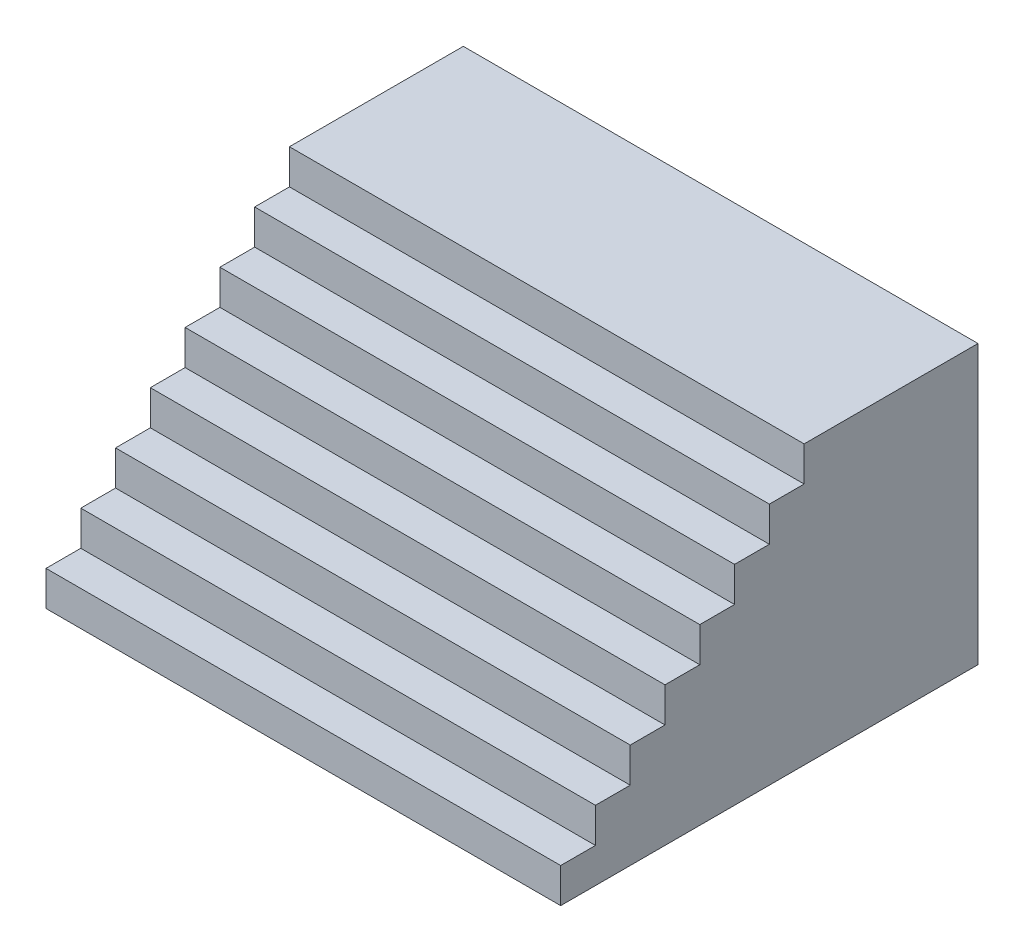
ISO-10303-21;
HEADER;
FILE_DESCRIPTION(('STEP AP214'),'2;1');
FILE_NAME('part.step','',(''),(''),'','','');
FILE_SCHEMA(('AUTOMOTIVE_DESIGN { 1 0 10303 214 1 1 1 1 }'));
ENDSEC;
DATA;
#1=APPLICATION_CONTEXT('core data for automotive mechanical design processes');
#2=APPLICATION_PROTOCOL_DEFINITION('international standard','automotive_design',2000,#1);
#3=PRODUCT_CONTEXT('',#1,'mechanical');
#4=PRODUCT('Part','Part','',(#3));
#5=PRODUCT_RELATED_PRODUCT_CATEGORY('part','',(#4));
#6=PRODUCT_DEFINITION_FORMATION('','',#4);
#7=PRODUCT_DEFINITION_CONTEXT('part definition',#1,'design');
#8=PRODUCT_DEFINITION('design','',#6,#7);
#9=PRODUCT_DEFINITION_SHAPE('','',#8);
#10=(LENGTH_UNIT() NAMED_UNIT(*) SI_UNIT(.MILLI.,.METRE.));
#11=(NAMED_UNIT(*) PLANE_ANGLE_UNIT() SI_UNIT($,.RADIAN.));
#12=(NAMED_UNIT(*) SI_UNIT($,.STERADIAN.) SOLID_ANGLE_UNIT());
#13=UNCERTAINTY_MEASURE_WITH_UNIT(LENGTH_MEASURE(1.E-05),#10,'distance_accuracy_value','');
#14=(GEOMETRIC_REPRESENTATION_CONTEXT(3) GLOBAL_UNCERTAINTY_ASSIGNED_CONTEXT((#13)) GLOBAL_UNIT_ASSIGNED_CONTEXT((#10,
#11,#12)) REPRESENTATION_CONTEXT('',''));
#15=CARTESIAN_POINT('',(0.,0.,0.));
#16=DIRECTION('',(0.,0.,1.));
#17=DIRECTION('',(1.,0.,0.));
#18=AXIS2_PLACEMENT_3D('',#15,#16,#17);
#19=CARTESIAN_POINT('',(-2.3933230814564E-13,0.,3000.));
#20=DIRECTION('',(0.,0.,1.));
#21=DIRECTION('',(1.,0.,0.));
#22=AXIS2_PLACEMENT_3D('',#19,#20,#21);
#23=PLANE('',#22);
#24=DIRECTION('',(-1.,0.,0.));
#25=VECTOR('',#24,1.);
#26=CARTESIAN_POINT('',(2150.,-750.,3000.));
#27=LINE('',#26,#25);
#28=CARTESIAN_POINT('',(1850.,-750.,3000.));
#29=VERTEX_POINT('',#28);
#30=CARTESIAN_POINT('',(-1850.,-750.,3000.));
#31=VERTEX_POINT('',#30);
#32=EDGE_CURVE('E222',#29,#31,#27,.T.);
#33=ORIENTED_EDGE('',*,*,#32,.T.);
#34=DIRECTION('',(0.,1.,0.));
#35=VECTOR('',#34,1.);
#36=CARTESIAN_POINT('',(-1850.,1000.,3000.));
#37=LINE('',#36,#35);
#38=CARTESIAN_POINT('',(-1850.,-1000.,3000.));
#39=VERTEX_POINT('',#38);
#40=EDGE_CURVE('E254',#39,#31,#37,.T.);
#41=ORIENTED_EDGE('',*,*,#40,.F.);
#42=DIRECTION('',(-1.,0.,0.));
#43=VECTOR('',#42,1.);
#44=CARTESIAN_POINT('',(-1850.,-1000.,3000.));
#45=LINE('',#44,#43);
#46=CARTESIAN_POINT('',(1850.,-1000.,3000.));
#47=VERTEX_POINT('',#46);
#48=EDGE_CURVE('E245',#47,#39,#45,.T.);
#49=ORIENTED_EDGE('',*,*,#48,.F.);
#50=DIRECTION('',(0.,-1.,0.));
#51=VECTOR('',#50,1.);
#52=CARTESIAN_POINT('',(1850.,1000.,3000.));
#53=LINE('',#52,#51);
#54=EDGE_CURVE('E235',#29,#47,#53,.T.);
#55=ORIENTED_EDGE('',*,*,#54,.F.);
#56=EDGE_LOOP('',(#33,#41,#49,#55));
#57=FACE_BOUND('',#56,.T.);
#58=ADVANCED_FACE('F74',(#57),#23,.T.);
#59=CARTESIAN_POINT('',(0.,0.,1.98951966012828E-13));
#60=DIRECTION('',(0.,0.,1.));
#61=DIRECTION('',(1.,0.,0.));
#62=AXIS2_PLACEMENT_3D('',#59,#60,#61);
#63=PLANE('',#62);
#64=DIRECTION('',(0.,-1.,0.));
#65=VECTOR('',#64,1.);
#66=CARTESIAN_POINT('',(1850.,1000.,1.28770024062494E-13));
#67=LINE('',#66,#65);
#68=CARTESIAN_POINT('',(1850.,1000.,1.28770024062494E-13));
#69=VERTEX_POINT('',#68);
#70=CARTESIAN_POINT('',(1850.,-1000.,1.28770024062494E-13));
#71=VERTEX_POINT('',#70);
#72=EDGE_CURVE('E97',#69,#71,#67,.T.);
#73=ORIENTED_EDGE('',*,*,#72,.T.);
#74=DIRECTION('',(-1.,0.,0.));
#75=VECTOR('',#74,1.);
#76=CARTESIAN_POINT('',(-1850.,-1000.,1.28770024062494E-13));
#77=LINE('',#76,#75);
#78=CARTESIAN_POINT('',(-1850.,-1000.,1.28770024062494E-13));
#79=VERTEX_POINT('',#78);
#80=EDGE_CURVE('E238',#71,#79,#77,.T.);
#81=ORIENTED_EDGE('',*,*,#80,.T.);
#82=DIRECTION('',(0.,1.,0.));
#83=VECTOR('',#82,1.);
#84=CARTESIAN_POINT('',(-1850.,1000.,1.28770024062494E-13));
#85=LINE('',#84,#83);
#86=CARTESIAN_POINT('',(-1850.,1000.,1.28770024062494E-13));
#87=VERTEX_POINT('',#86);
#88=EDGE_CURVE('E248',#79,#87,#85,.T.);
#89=ORIENTED_EDGE('',*,*,#88,.T.);
#90=DIRECTION('',(1.,0.,0.));
#91=VECTOR('',#90,1.);
#92=CARTESIAN_POINT('',(-1850.,1000.,1.28770024062494E-13));
#93=LINE('',#92,#91);
#94=EDGE_CURVE('E221',#87,#69,#93,.T.);
#95=ORIENTED_EDGE('',*,*,#94,.T.);
#96=EDGE_LOOP('',(#73,#81,#89,#95));
#97=FACE_BOUND('',#96,.T.);
#98=ADVANCED_FACE('F276',(#97),#63,.F.);
#99=CARTESIAN_POINT('',(-1850.,1000.,1.28770024062494E-13));
#100=DIRECTION('',(0.,-1.,0.));
#101=DIRECTION('',(0.,0.,-1.));
#102=AXIS2_PLACEMENT_3D('',#99,#100,#101);
#103=PLANE('',#102);
#104=DIRECTION('',(0.,0.,1.));
#105=VECTOR('',#104,1.);
#106=CARTESIAN_POINT('',(-1850.,1000.,1.28770024062494E-13));
#107=LINE('',#106,#105);
#108=CARTESIAN_POINT('',(-1850.,1000.,1250.));
#109=VERTEX_POINT('',#108);
#110=EDGE_CURVE('E213',#87,#109,#107,.T.);
#111=ORIENTED_EDGE('',*,*,#110,.T.);
#112=DIRECTION('',(-1.,0.,0.));
#113=VECTOR('',#112,1.);
#114=CARTESIAN_POINT('',(2150.,1000.,1250.));
#115=LINE('',#114,#113);
#116=CARTESIAN_POINT('',(1850.,1000.,1250.));
#117=VERTEX_POINT('',#116);
#118=EDGE_CURVE('E198',#117,#109,#115,.T.);
#119=ORIENTED_EDGE('',*,*,#118,.F.);
#120=DIRECTION('',(0.,0.,1.));
#121=VECTOR('',#120,1.);
#122=CARTESIAN_POINT('',(1850.,1000.,1.28770024062494E-13));
#123=LINE('',#122,#121);
#124=EDGE_CURVE('E224',#69,#117,#123,.T.);
#125=ORIENTED_EDGE('',*,*,#124,.F.);
#126=ORIENTED_EDGE('',*,*,#94,.F.);
#127=EDGE_LOOP('',(#111,#119,#125,#126));
#128=FACE_BOUND('',#127,.T.);
#129=ADVANCED_FACE('F219',(#128),#103,.F.);
#130=CARTESIAN_POINT('',(-1850.,1000.,1.28770024062494E-13));
#131=DIRECTION('',(1.,0.,0.));
#132=DIRECTION('',(0.,0.,-1.));
#133=AXIS2_PLACEMENT_3D('',#130,#131,#132);
#134=PLANE('',#133);
#135=ORIENTED_EDGE('',*,*,#40,.T.);
#136=DIRECTION('',(0.,0.,1.));
#137=VECTOR('',#136,1.);
#138=CARTESIAN_POINT('',(-1850.,-750.,3000.));
#139=LINE('',#138,#137);
#140=CARTESIAN_POINT('',(-1850.,-750.,2750.));
#141=VERTEX_POINT('',#140);
#142=EDGE_CURVE('E207',#141,#31,#139,.T.);
#143=ORIENTED_EDGE('',*,*,#142,.F.);
#144=DIRECTION('',(0.,-1.,0.));
#145=VECTOR('',#144,1.);
#146=CARTESIAN_POINT('',(-1850.,-750.,2750.));
#147=LINE('',#146,#145);
#148=CARTESIAN_POINT('',(-1850.,-500.,2750.));
#149=VERTEX_POINT('',#148);
#150=EDGE_CURVE('E290',#149,#141,#147,.T.);
#151=ORIENTED_EDGE('',*,*,#150,.F.);
#152=DIRECTION('',(0.,0.,1.));
#153=VECTOR('',#152,1.);
#154=CARTESIAN_POINT('',(-1850.,-500.,2750.));
#155=LINE('',#154,#153);
#156=CARTESIAN_POINT('',(-1850.,-500.,2500.));
#157=VERTEX_POINT('',#156);
#158=EDGE_CURVE('E292',#157,#149,#155,.T.);
#159=ORIENTED_EDGE('',*,*,#158,.F.);
#160=DIRECTION('',(0.,-1.,0.));
#161=VECTOR('',#160,1.);
#162=CARTESIAN_POINT('',(-1850.,-500.,2500.));
#163=LINE('',#162,#161);
#164=CARTESIAN_POINT('',(-1850.,-250.,2500.));
#165=VERTEX_POINT('',#164);
#166=EDGE_CURVE('E363',#165,#157,#163,.T.);
#167=ORIENTED_EDGE('',*,*,#166,.F.);
#168=DIRECTION('',(0.,0.,1.));
#169=VECTOR('',#168,1.);
#170=CARTESIAN_POINT('',(-1850.,-250.,2500.));
#171=LINE('',#170,#169);
#172=CARTESIAN_POINT('',(-1850.,-250.,2250.));
#173=VERTEX_POINT('',#172);
#174=EDGE_CURVE('E364',#173,#165,#171,.T.);
#175=ORIENTED_EDGE('',*,*,#174,.F.);
#176=DIRECTION('',(0.,-1.,0.));
#177=VECTOR('',#176,1.);
#178=CARTESIAN_POINT('',(-1850.,-250.,2250.));
#179=LINE('',#178,#177);
#180=CARTESIAN_POINT('',(-1850.,0.,2250.));
#181=VERTEX_POINT('',#180);
#182=EDGE_CURVE('E369',#181,#173,#179,.T.);
#183=ORIENTED_EDGE('',*,*,#182,.F.);
#184=DIRECTION('',(0.,0.,1.));
#185=VECTOR('',#184,1.);
#186=CARTESIAN_POINT('',(-1850.,0.,2250.));
#187=LINE('',#186,#185);
#188=CARTESIAN_POINT('',(-1850.,0.,2000.));
#189=VERTEX_POINT('',#188);
#190=EDGE_CURVE('E372',#189,#181,#187,.T.);
#191=ORIENTED_EDGE('',*,*,#190,.F.);
#192=DIRECTION('',(0.,-1.,0.));
#193=VECTOR('',#192,1.);
#194=CARTESIAN_POINT('',(-1850.,0.,2000.));
#195=LINE('',#194,#193);
#196=CARTESIAN_POINT('',(-1850.,250.,2000.));
#197=VERTEX_POINT('',#196);
#198=EDGE_CURVE('E375',#197,#189,#195,.T.);
#199=ORIENTED_EDGE('',*,*,#198,.F.);
#200=DIRECTION('',(0.,0.,1.));
#201=VECTOR('',#200,1.);
#202=CARTESIAN_POINT('',(-1850.,250.,2000.));
#203=LINE('',#202,#201);
#204=CARTESIAN_POINT('',(-1850.,250.,1750.));
#205=VERTEX_POINT('',#204);
#206=EDGE_CURVE('E378',#205,#197,#203,.T.);
#207=ORIENTED_EDGE('',*,*,#206,.F.);
#208=DIRECTION('',(0.,-1.,0.));
#209=VECTOR('',#208,1.);
#210=CARTESIAN_POINT('',(-1850.,250.,1750.));
#211=LINE('',#210,#209);
#212=CARTESIAN_POINT('',(-1850.,500.,1750.));
#213=VERTEX_POINT('',#212);
#214=EDGE_CURVE('E381',#213,#205,#211,.T.);
#215=ORIENTED_EDGE('',*,*,#214,.F.);
#216=DIRECTION('',(0.,0.,1.));
#217=VECTOR('',#216,1.);
#218=CARTESIAN_POINT('',(-1850.,500.,1750.));
#219=LINE('',#218,#217);
#220=CARTESIAN_POINT('',(-1850.,500.,1500.));
#221=VERTEX_POINT('',#220);
#222=EDGE_CURVE('E384',#221,#213,#219,.T.);
#223=ORIENTED_EDGE('',*,*,#222,.F.);
#224=DIRECTION('',(0.,-1.,0.));
#225=VECTOR('',#224,1.);
#226=CARTESIAN_POINT('',(-1850.,500.,1500.));
#227=LINE('',#226,#225);
#228=CARTESIAN_POINT('',(-1850.,750.,1500.));
#229=VERTEX_POINT('',#228);
#230=EDGE_CURVE('E387',#229,#221,#227,.T.);
#231=ORIENTED_EDGE('',*,*,#230,.F.);
#232=DIRECTION('',(0.,0.,1.));
#233=VECTOR('',#232,1.);
#234=CARTESIAN_POINT('',(-1850.,750.,1500.));
#235=LINE('',#234,#233);
#236=CARTESIAN_POINT('',(-1850.,750.,1250.));
#237=VERTEX_POINT('',#236);
#238=EDGE_CURVE('E217',#237,#229,#235,.T.);
#239=ORIENTED_EDGE('',*,*,#238,.F.);
#240=DIRECTION('',(0.,-1.,0.));
#241=VECTOR('',#240,1.);
#242=CARTESIAN_POINT('',(-1850.,750.,1250.));
#243=LINE('',#242,#241);
#244=EDGE_CURVE('E201',#109,#237,#243,.T.);
#245=ORIENTED_EDGE('',*,*,#244,.F.);
#246=ORIENTED_EDGE('',*,*,#110,.F.);
#247=ORIENTED_EDGE('',*,*,#88,.F.);
#248=DIRECTION('',(0.,0.,1.));
#249=VECTOR('',#248,1.);
#250=CARTESIAN_POINT('',(-1850.,-1000.,1.28770024062494E-13));
#251=LINE('',#250,#249);
#252=EDGE_CURVE('E251',#79,#39,#251,.T.);
#253=ORIENTED_EDGE('',*,*,#252,.T.);
#254=EDGE_LOOP('',(#135,#143,#151,#159,#167,#175,#183,#191,#199,#207,#215,#223,#231,#239,#245,
#246,#247,#253));
#255=FACE_BOUND('',#254,.T.);
#256=ADVANCED_FACE('F212',(#255),#134,.F.);
#257=CARTESIAN_POINT('',(-1850.,-1000.,1.28770024062494E-13));
#258=DIRECTION('',(0.,1.,0.));
#259=DIRECTION('',(0.,0.,1.));
#260=AXIS2_PLACEMENT_3D('',#257,#258,#259);
#261=PLANE('',#260);
#262=ORIENTED_EDGE('',*,*,#48,.T.);
#263=ORIENTED_EDGE('',*,*,#252,.F.);
#264=ORIENTED_EDGE('',*,*,#80,.F.);
#265=DIRECTION('',(0.,0.,1.));
#266=VECTOR('',#265,1.);
#267=CARTESIAN_POINT('',(1850.,-1000.,1.28770024062494E-13));
#268=LINE('',#267,#266);
#269=EDGE_CURVE('E247',#71,#47,#268,.T.);
#270=ORIENTED_EDGE('',*,*,#269,.T.);
#271=EDGE_LOOP('',(#262,#263,#264,#270));
#272=FACE_BOUND('',#271,.T.);
#273=ADVANCED_FACE('F279',(#272),#261,.F.);
#274=CARTESIAN_POINT('',(1850.,1000.,1.28770024062494E-13));
#275=DIRECTION('',(-1.,0.,0.));
#276=DIRECTION('',(0.,0.,1.));
#277=AXIS2_PLACEMENT_3D('',#274,#275,#276);
#278=PLANE('',#277);
#279=DIRECTION('',(0.,-1.,0.));
#280=VECTOR('',#279,1.);
#281=CARTESIAN_POINT('',(1850.,1000.,2750.));
#282=LINE('',#281,#280);
#283=CARTESIAN_POINT('',(1850.,-500.,2750.));
#284=VERTEX_POINT('',#283);
#285=CARTESIAN_POINT('',(1850.,-750.,2750.));
#286=VERTEX_POINT('',#285);
#287=EDGE_CURVE('E81',#284,#286,#282,.T.);
#288=ORIENTED_EDGE('',*,*,#287,.T.);
#289=DIRECTION('',(0.,0.,1.));
#290=VECTOR('',#289,1.);
#291=CARTESIAN_POINT('',(1850.,-750.,1.28770024062494E-13));
#292=LINE('',#291,#290);
#293=EDGE_CURVE('E12',#286,#29,#292,.T.);
#294=ORIENTED_EDGE('',*,*,#293,.T.);
#295=ORIENTED_EDGE('',*,*,#54,.T.);
#296=ORIENTED_EDGE('',*,*,#269,.F.);
#297=ORIENTED_EDGE('',*,*,#72,.F.);
#298=ORIENTED_EDGE('',*,*,#124,.T.);
#299=DIRECTION('',(0.,-1.,0.));
#300=VECTOR('',#299,1.);
#301=CARTESIAN_POINT('',(1850.,1000.,1250.));
#302=LINE('',#301,#300);
#303=CARTESIAN_POINT('',(1850.,750.,1250.));
#304=VERTEX_POINT('',#303);
#305=EDGE_CURVE('E204',#117,#304,#302,.T.);
#306=ORIENTED_EDGE('',*,*,#305,.T.);
#307=DIRECTION('',(0.,0.,1.));
#308=VECTOR('',#307,1.);
#309=CARTESIAN_POINT('',(1850.,750.,1.28770024062494E-13));
#310=LINE('',#309,#308);
#311=CARTESIAN_POINT('',(1850.,750.,1500.));
#312=VERTEX_POINT('',#311);
#313=EDGE_CURVE('E322',#304,#312,#310,.T.);
#314=ORIENTED_EDGE('',*,*,#313,.T.);
#315=DIRECTION('',(0.,-1.,0.));
#316=VECTOR('',#315,1.);
#317=CARTESIAN_POINT('',(1850.,1000.,1500.));
#318=LINE('',#317,#316);
#319=CARTESIAN_POINT('',(1850.,500.,1500.));
#320=VERTEX_POINT('',#319);
#321=EDGE_CURVE('E324',#312,#320,#318,.T.);
#322=ORIENTED_EDGE('',*,*,#321,.T.);
#323=DIRECTION('',(0.,0.,1.));
#324=VECTOR('',#323,1.);
#325=CARTESIAN_POINT('',(1850.,500.,1.28770024062494E-13));
#326=LINE('',#325,#324);
#327=CARTESIAN_POINT('',(1850.,500.,1750.));
#328=VERTEX_POINT('',#327);
#329=EDGE_CURVE('E325',#320,#328,#326,.T.);
#330=ORIENTED_EDGE('',*,*,#329,.T.);
#331=DIRECTION('',(0.,-1.,0.));
#332=VECTOR('',#331,1.);
#333=CARTESIAN_POINT('',(1850.,1000.,1750.));
#334=LINE('',#333,#332);
#335=CARTESIAN_POINT('',(1850.,250.,1750.));
#336=VERTEX_POINT('',#335);
#337=EDGE_CURVE('E330',#328,#336,#334,.T.);
#338=ORIENTED_EDGE('',*,*,#337,.T.);
#339=DIRECTION('',(0.,0.,1.));
#340=VECTOR('',#339,1.);
#341=CARTESIAN_POINT('',(1850.,250.,0.));
#342=LINE('',#341,#340);
#343=CARTESIAN_POINT('',(1850.,250.,2000.));
#344=VERTEX_POINT('',#343);
#345=EDGE_CURVE('E333',#336,#344,#342,.T.);
#346=ORIENTED_EDGE('',*,*,#345,.T.);
#347=DIRECTION('',(0.,-1.,0.));
#348=VECTOR('',#347,1.);
#349=CARTESIAN_POINT('',(1850.,1000.,2000.));
#350=LINE('',#349,#348);
#351=CARTESIAN_POINT('',(1850.,0.,2000.));
#352=VERTEX_POINT('',#351);
#353=EDGE_CURVE('E336',#344,#352,#350,.T.);
#354=ORIENTED_EDGE('',*,*,#353,.T.);
#355=DIRECTION('',(0.,0.,1.));
#356=VECTOR('',#355,1.);
#357=CARTESIAN_POINT('',(1850.,-2.22044604925031E-13,2.51234703977229E-13));
#358=LINE('',#357,#356);
#359=CARTESIAN_POINT('',(1850.,0.,2250.));
#360=VERTEX_POINT('',#359);
#361=EDGE_CURVE('E339',#352,#360,#358,.T.);
#362=ORIENTED_EDGE('',*,*,#361,.T.);
#363=DIRECTION('',(0.,-1.,0.));
#364=VECTOR('',#363,1.);
#365=CARTESIAN_POINT('',(1850.,1000.,2250.));
#366=LINE('',#365,#364);
#367=CARTESIAN_POINT('',(1850.,-250.,2250.));
#368=VERTEX_POINT('',#367);
#369=EDGE_CURVE('E342',#360,#368,#366,.T.);
#370=ORIENTED_EDGE('',*,*,#369,.T.);
#371=DIRECTION('',(0.,0.,1.));
#372=VECTOR('',#371,1.);
#373=CARTESIAN_POINT('',(1850.,-250.000000000001,4.06325780218783E-13));
#374=LINE('',#373,#372);
#375=CARTESIAN_POINT('',(1850.,-250.,2500.));
#376=VERTEX_POINT('',#375);
#377=EDGE_CURVE('E345',#368,#376,#374,.T.);
#378=ORIENTED_EDGE('',*,*,#377,.T.);
#379=DIRECTION('',(0.,-1.,0.));
#380=VECTOR('',#379,1.);
#381=CARTESIAN_POINT('',(1850.,1000.,2500.));
#382=LINE('',#381,#380);
#383=CARTESIAN_POINT('',(1850.,-500.,2500.));
#384=VERTEX_POINT('',#383);
#385=EDGE_CURVE('E348',#376,#384,#382,.T.);
#386=ORIENTED_EDGE('',*,*,#385,.T.);
#387=DIRECTION('',(0.,0.,1.));
#388=VECTOR('',#387,1.);
#389=CARTESIAN_POINT('',(1850.,-500.,1.28770024062494E-13));
#390=LINE('',#389,#388);
#391=EDGE_CURVE('E351',#384,#284,#390,.T.);
#392=ORIENTED_EDGE('',*,*,#391,.T.);
#393=EDGE_LOOP('',(#288,#294,#295,#296,#297,#298,#306,#314,#322,#330,#338,#346,#354,#362,#370,
#378,#386,#392));
#394=FACE_BOUND('',#393,.T.);
#395=ADVANCED_FACE('F282',(#394),#278,.F.);
#396=CARTESIAN_POINT('',(2150.,-750.,3000.));
#397=DIRECTION('',(0.,-1.,0.));
#398=DIRECTION('',(0.,0.,-1.));
#399=AXIS2_PLACEMENT_3D('',#396,#397,#398);
#400=PLANE('',#399);
#401=DIRECTION('',(-1.,0.,0.));
#402=VECTOR('',#401,1.);
#403=CARTESIAN_POINT('',(2150.,-750.,2750.));
#404=LINE('',#403,#402);
#405=EDGE_CURVE('E227',#286,#141,#404,.T.);
#406=ORIENTED_EDGE('',*,*,#405,.T.);
#407=ORIENTED_EDGE('',*,*,#142,.T.);
#408=ORIENTED_EDGE('',*,*,#32,.F.);
#409=ORIENTED_EDGE('',*,*,#293,.F.);
#410=EDGE_LOOP('',(#406,#407,#408,#409));
#411=FACE_BOUND('',#410,.T.);
#412=ADVANCED_FACE('F286',(#411),#400,.F.);
#413=CARTESIAN_POINT('',(2150.,-750.,2750.));
#414=DIRECTION('',(0.,0.,-1.));
#415=DIRECTION('',(-1.,0.,0.));
#416=AXIS2_PLACEMENT_3D('',#413,#414,#415);
#417=PLANE('',#416);
#418=DIRECTION('',(-1.,0.,0.));
#419=VECTOR('',#418,1.);
#420=CARTESIAN_POINT('',(2150.,-500.,2750.));
#421=LINE('',#420,#419);
#422=EDGE_CURVE('E297',#284,#149,#421,.T.);
#423=ORIENTED_EDGE('',*,*,#422,.T.);
#424=ORIENTED_EDGE('',*,*,#150,.T.);
#425=ORIENTED_EDGE('',*,*,#405,.F.);
#426=ORIENTED_EDGE('',*,*,#287,.F.);
#427=EDGE_LOOP('',(#423,#424,#425,#426));
#428=FACE_BOUND('',#427,.T.);
#429=ADVANCED_FACE('F355',(#428),#417,.F.);
#430=CARTESIAN_POINT('',(2150.,-500.,2750.));
#431=DIRECTION('',(0.,-1.,0.));
#432=DIRECTION('',(0.,0.,-1.));
#433=AXIS2_PLACEMENT_3D('',#430,#431,#432);
#434=PLANE('',#433);
#435=DIRECTION('',(-1.,0.,0.));
#436=VECTOR('',#435,1.);
#437=CARTESIAN_POINT('',(2150.,-500.,2500.));
#438=LINE('',#437,#436);
#439=EDGE_CURVE('E299',#384,#157,#438,.T.);
#440=ORIENTED_EDGE('',*,*,#439,.T.);
#441=ORIENTED_EDGE('',*,*,#158,.T.);
#442=ORIENTED_EDGE('',*,*,#422,.F.);
#443=ORIENTED_EDGE('',*,*,#391,.F.);
#444=EDGE_LOOP('',(#440,#441,#442,#443));
#445=FACE_BOUND('',#444,.T.);
#446=ADVANCED_FACE('F358',(#445),#434,.F.);
#447=CARTESIAN_POINT('',(2150.,-500.,2500.));
#448=DIRECTION('',(0.,0.,-1.));
#449=DIRECTION('',(-1.,0.,0.));
#450=AXIS2_PLACEMENT_3D('',#447,#448,#449);
#451=PLANE('',#450);
#452=DIRECTION('',(-1.,0.,0.));
#453=VECTOR('',#452,1.);
#454=CARTESIAN_POINT('',(2150.,-250.,2500.));
#455=LINE('',#454,#453);
#456=EDGE_CURVE('E301',#376,#165,#455,.T.);
#457=ORIENTED_EDGE('',*,*,#456,.T.);
#458=ORIENTED_EDGE('',*,*,#166,.T.);
#459=ORIENTED_EDGE('',*,*,#439,.F.);
#460=ORIENTED_EDGE('',*,*,#385,.F.);
#461=EDGE_LOOP('',(#457,#458,#459,#460));
#462=FACE_BOUND('',#461,.T.);
#463=ADVANCED_FACE('F422',(#462),#451,.F.);
#464=CARTESIAN_POINT('',(2150.,-250.,2500.));
#465=DIRECTION('',(0.,-1.,0.));
#466=DIRECTION('',(0.,0.,-1.));
#467=AXIS2_PLACEMENT_3D('',#464,#465,#466);
#468=PLANE('',#467);
#469=DIRECTION('',(-1.,0.,0.));
#470=VECTOR('',#469,1.);
#471=CARTESIAN_POINT('',(2150.,-250.,2250.));
#472=LINE('',#471,#470);
#473=EDGE_CURVE('E303',#368,#173,#472,.T.);
#474=ORIENTED_EDGE('',*,*,#473,.T.);
#475=ORIENTED_EDGE('',*,*,#174,.T.);
#476=ORIENTED_EDGE('',*,*,#456,.F.);
#477=ORIENTED_EDGE('',*,*,#377,.F.);
#478=EDGE_LOOP('',(#474,#475,#476,#477));
#479=FACE_BOUND('',#478,.T.);
#480=ADVANCED_FACE('F419',(#479),#468,.F.);
#481=CARTESIAN_POINT('',(2150.,-250.,2250.));
#482=DIRECTION('',(0.,0.,-1.));
#483=DIRECTION('',(-1.,0.,0.));
#484=AXIS2_PLACEMENT_3D('',#481,#482,#483);
#485=PLANE('',#484);
#486=DIRECTION('',(-1.,0.,0.));
#487=VECTOR('',#486,1.);
#488=CARTESIAN_POINT('',(2150.,0.,2250.));
#489=LINE('',#488,#487);
#490=EDGE_CURVE('E305',#360,#181,#489,.T.);
#491=ORIENTED_EDGE('',*,*,#490,.T.);
#492=ORIENTED_EDGE('',*,*,#182,.T.);
#493=ORIENTED_EDGE('',*,*,#473,.F.);
#494=ORIENTED_EDGE('',*,*,#369,.F.);
#495=EDGE_LOOP('',(#491,#492,#493,#494));
#496=FACE_BOUND('',#495,.T.);
#497=ADVANCED_FACE('F415',(#496),#485,.F.);
#498=CARTESIAN_POINT('',(2150.,0.,2250.));
#499=DIRECTION('',(0.,-1.,0.));
#500=DIRECTION('',(0.,0.,-1.));
#501=AXIS2_PLACEMENT_3D('',#498,#499,#500);
#502=PLANE('',#501);
#503=DIRECTION('',(-1.,0.,0.));
#504=VECTOR('',#503,1.);
#505=CARTESIAN_POINT('',(2150.,0.,2000.));
#506=LINE('',#505,#504);
#507=EDGE_CURVE('E307',#352,#189,#506,.T.);
#508=ORIENTED_EDGE('',*,*,#507,.T.);
#509=ORIENTED_EDGE('',*,*,#190,.T.);
#510=ORIENTED_EDGE('',*,*,#490,.F.);
#511=ORIENTED_EDGE('',*,*,#361,.F.);
#512=EDGE_LOOP('',(#508,#509,#510,#511));
#513=FACE_BOUND('',#512,.T.);
#514=ADVANCED_FACE('F412',(#513),#502,.F.);
#515=CARTESIAN_POINT('',(2150.,0.,2000.));
#516=DIRECTION('',(0.,0.,-1.));
#517=DIRECTION('',(-1.,0.,0.));
#518=AXIS2_PLACEMENT_3D('',#515,#516,#517);
#519=PLANE('',#518);
#520=DIRECTION('',(-1.,0.,0.));
#521=VECTOR('',#520,1.);
#522=CARTESIAN_POINT('',(2150.,250.,2000.));
#523=LINE('',#522,#521);
#524=EDGE_CURVE('E309',#344,#197,#523,.T.);
#525=ORIENTED_EDGE('',*,*,#524,.T.);
#526=ORIENTED_EDGE('',*,*,#198,.T.);
#527=ORIENTED_EDGE('',*,*,#507,.F.);
#528=ORIENTED_EDGE('',*,*,#353,.F.);
#529=EDGE_LOOP('',(#525,#526,#527,#528));
#530=FACE_BOUND('',#529,.T.);
#531=ADVANCED_FACE('F407',(#530),#519,.F.);
#532=CARTESIAN_POINT('',(2150.,250.,2000.));
#533=DIRECTION('',(0.,-1.,0.));
#534=DIRECTION('',(0.,0.,-1.));
#535=AXIS2_PLACEMENT_3D('',#532,#533,#534);
#536=PLANE('',#535);
#537=DIRECTION('',(-1.,0.,0.));
#538=VECTOR('',#537,1.);
#539=CARTESIAN_POINT('',(2150.,250.,1750.));
#540=LINE('',#539,#538);
#541=EDGE_CURVE('E311',#336,#205,#540,.T.);
#542=ORIENTED_EDGE('',*,*,#541,.T.);
#543=ORIENTED_EDGE('',*,*,#206,.T.);
#544=ORIENTED_EDGE('',*,*,#524,.F.);
#545=ORIENTED_EDGE('',*,*,#345,.F.);
#546=EDGE_LOOP('',(#542,#543,#544,#545));
#547=FACE_BOUND('',#546,.T.);
#548=ADVANCED_FACE('F403',(#547),#536,.F.);
#549=CARTESIAN_POINT('',(2150.,250.,1750.));
#550=DIRECTION('',(0.,0.,-1.));
#551=DIRECTION('',(-1.,0.,0.));
#552=AXIS2_PLACEMENT_3D('',#549,#550,#551);
#553=PLANE('',#552);
#554=DIRECTION('',(-1.,0.,0.));
#555=VECTOR('',#554,1.);
#556=CARTESIAN_POINT('',(2150.,500.,1750.));
#557=LINE('',#556,#555);
#558=EDGE_CURVE('E313',#328,#213,#557,.T.);
#559=ORIENTED_EDGE('',*,*,#558,.T.);
#560=ORIENTED_EDGE('',*,*,#214,.T.);
#561=ORIENTED_EDGE('',*,*,#541,.F.);
#562=ORIENTED_EDGE('',*,*,#337,.F.);
#563=EDGE_LOOP('',(#559,#560,#561,#562));
#564=FACE_BOUND('',#563,.T.);
#565=ADVANCED_FACE('F401',(#564),#553,.F.);
#566=CARTESIAN_POINT('',(2150.,500.,1750.));
#567=DIRECTION('',(0.,-1.,0.));
#568=DIRECTION('',(0.,0.,-1.));
#569=AXIS2_PLACEMENT_3D('',#566,#567,#568);
#570=PLANE('',#569);
#571=DIRECTION('',(-1.,0.,0.));
#572=VECTOR('',#571,1.);
#573=CARTESIAN_POINT('',(2150.,500.,1500.));
#574=LINE('',#573,#572);
#575=EDGE_CURVE('E315',#320,#221,#574,.T.);
#576=ORIENTED_EDGE('',*,*,#575,.T.);
#577=ORIENTED_EDGE('',*,*,#222,.T.);
#578=ORIENTED_EDGE('',*,*,#558,.F.);
#579=ORIENTED_EDGE('',*,*,#329,.F.);
#580=EDGE_LOOP('',(#576,#577,#578,#579));
#581=FACE_BOUND('',#580,.T.);
#582=ADVANCED_FACE('F398',(#581),#570,.F.);
#583=CARTESIAN_POINT('',(2150.,500.,1500.));
#584=DIRECTION('',(0.,0.,-1.));
#585=DIRECTION('',(-1.,0.,0.));
#586=AXIS2_PLACEMENT_3D('',#583,#584,#585);
#587=PLANE('',#586);
#588=DIRECTION('',(-1.,0.,0.));
#589=VECTOR('',#588,1.);
#590=CARTESIAN_POINT('',(2150.,750.,1500.));
#591=LINE('',#590,#589);
#592=EDGE_CURVE('E317',#312,#229,#591,.T.);
#593=ORIENTED_EDGE('',*,*,#592,.T.);
#594=ORIENTED_EDGE('',*,*,#230,.T.);
#595=ORIENTED_EDGE('',*,*,#575,.F.);
#596=ORIENTED_EDGE('',*,*,#321,.F.);
#597=EDGE_LOOP('',(#593,#594,#595,#596));
#598=FACE_BOUND('',#597,.T.);
#599=ADVANCED_FACE('F393',(#598),#587,.F.);
#600=CARTESIAN_POINT('',(2150.,750.,1500.));
#601=DIRECTION('',(0.,-1.,0.));
#602=DIRECTION('',(0.,0.,-1.));
#603=AXIS2_PLACEMENT_3D('',#600,#601,#602);
#604=PLANE('',#603);
#605=DIRECTION('',(-1.,0.,0.));
#606=VECTOR('',#605,1.);
#607=CARTESIAN_POINT('',(2150.,750.,1250.));
#608=LINE('',#607,#606);
#609=EDGE_CURVE('E88',#304,#237,#608,.T.);
#610=ORIENTED_EDGE('',*,*,#609,.T.);
#611=ORIENTED_EDGE('',*,*,#238,.T.);
#612=ORIENTED_EDGE('',*,*,#592,.F.);
#613=ORIENTED_EDGE('',*,*,#313,.F.);
#614=EDGE_LOOP('',(#610,#611,#612,#613));
#615=FACE_BOUND('',#614,.T.);
#616=ADVANCED_FACE('F319',(#615),#604,.F.);
#617=CARTESIAN_POINT('',(2150.,750.,1250.));
#618=DIRECTION('',(0.,0.,-1.));
#619=DIRECTION('',(-1.,0.,0.));
#620=AXIS2_PLACEMENT_3D('',#617,#618,#619);
#621=PLANE('',#620);
#622=ORIENTED_EDGE('',*,*,#118,.T.);
#623=ORIENTED_EDGE('',*,*,#244,.T.);
#624=ORIENTED_EDGE('',*,*,#609,.F.);
#625=ORIENTED_EDGE('',*,*,#305,.F.);
#626=EDGE_LOOP('',(#622,#623,#624,#625));
#627=FACE_BOUND('',#626,.T.);
#628=ADVANCED_FACE('F200',(#627),#621,.F.);
#629=CLOSED_SHELL('',(#58,#98,#129,#256,#273,#395,#412,#429,#446,#463,#480,#497,#514,#531,#548,
#565,#582,#599,#616,#628));
#630=MANIFOLD_SOLID_BREP('B2',#629);
#631=ADVANCED_BREP_SHAPE_REPRESENTATION('',(#18,#630),#14);
#632=SHAPE_DEFINITION_REPRESENTATION(#9,#631);
ENDSEC;
END-ISO-10303-21;
